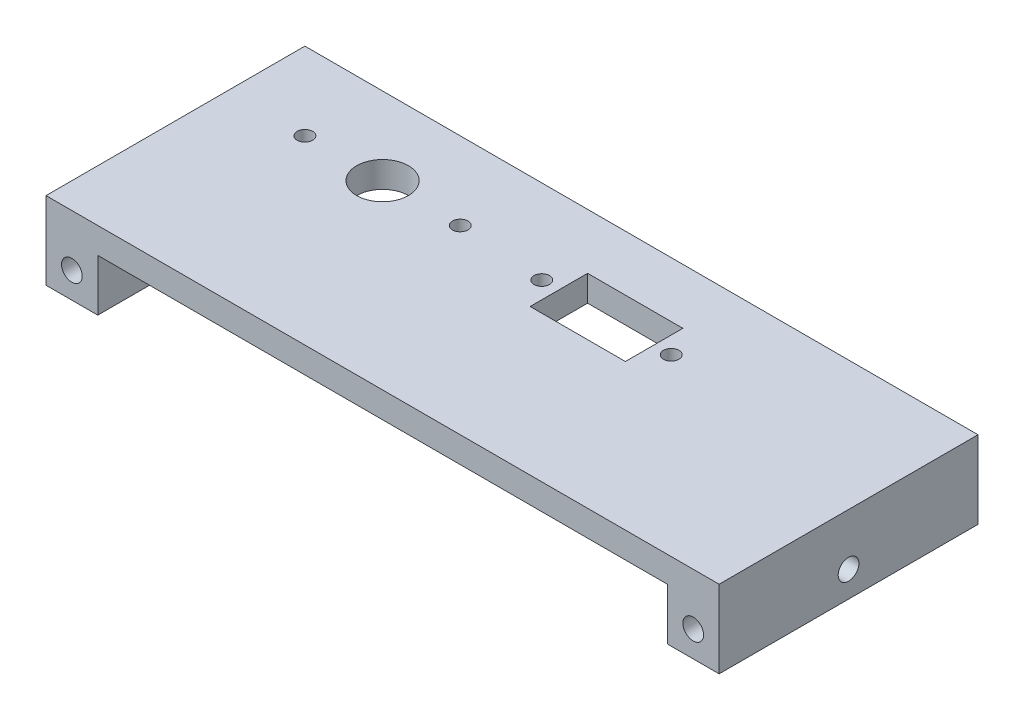
ISO-10303-21;
HEADER;
FILE_DESCRIPTION(('STEP AP214'),'2;1');
FILE_NAME('part.step','',(''),(''),'','','');
FILE_SCHEMA(('AUTOMOTIVE_DESIGN { 1 0 10303 214 1 1 1 1 }'));
ENDSEC;
DATA;
#1=APPLICATION_CONTEXT('core data for automotive mechanical design processes');
#2=APPLICATION_PROTOCOL_DEFINITION('international standard','automotive_design',2000,#1);
#3=PRODUCT_CONTEXT('',#1,'mechanical');
#4=PRODUCT('Part','Part','',(#3));
#5=PRODUCT_RELATED_PRODUCT_CATEGORY('part','',(#4));
#6=PRODUCT_DEFINITION_FORMATION('','',#4);
#7=PRODUCT_DEFINITION_CONTEXT('part definition',#1,'design');
#8=PRODUCT_DEFINITION('design','',#6,#7);
#9=PRODUCT_DEFINITION_SHAPE('','',#8);
#10=(LENGTH_UNIT() NAMED_UNIT(*) SI_UNIT(.MILLI.,.METRE.));
#11=(NAMED_UNIT(*) PLANE_ANGLE_UNIT() SI_UNIT($,.RADIAN.));
#12=(NAMED_UNIT(*) SI_UNIT($,.STERADIAN.) SOLID_ANGLE_UNIT());
#13=UNCERTAINTY_MEASURE_WITH_UNIT(LENGTH_MEASURE(1.E-05),#10,'distance_accuracy_value','');
#14=(GEOMETRIC_REPRESENTATION_CONTEXT(3) GLOBAL_UNCERTAINTY_ASSIGNED_CONTEXT((#13)) GLOBAL_UNIT_ASSIGNED_CONTEXT((#10,
#11,#12)) REPRESENTATION_CONTEXT('',''));
#15=CARTESIAN_POINT('',(0.,0.,0.));
#16=DIRECTION('',(0.,0.,1.));
#17=DIRECTION('',(1.,0.,0.));
#18=AXIS2_PLACEMENT_3D('',#15,#16,#17);
#19=CARTESIAN_POINT('',(0.,0.,0.));
#20=DIRECTION('',(0.,1.,0.));
#21=DIRECTION('',(0.,0.,1.));
#22=AXIS2_PLACEMENT_3D('',#19,#20,#21);
#23=PLANE('',#22);
#24=DIRECTION('',(-1.,0.,0.));
#25=VECTOR('',#24,1.);
#26=CARTESIAN_POINT('',(-130.,0.,-50.));
#27=LINE('',#26,#25);
#28=CARTESIAN_POINT('',(-120.,0.,-50.));
#29=VERTEX_POINT('',#28);
#30=CARTESIAN_POINT('',(-130.,0.,-50.));
#31=VERTEX_POINT('',#30);
#32=EDGE_CURVE('E284',#29,#31,#27,.T.);
#33=ORIENTED_EDGE('',*,*,#32,.F.);
#34=DIRECTION('',(0.,0.,1.));
#35=VECTOR('',#34,1.);
#36=CARTESIAN_POINT('',(-120.,0.,0.));
#37=LINE('',#36,#35);
#38=CARTESIAN_POINT('',(-120.,0.,0.));
#39=VERTEX_POINT('',#38);
#40=EDGE_CURVE('E307',#29,#39,#37,.T.);
#41=ORIENTED_EDGE('',*,*,#40,.T.);
#42=DIRECTION('',(1.,0.,0.));
#43=VECTOR('',#42,1.);
#44=CARTESIAN_POINT('',(-130.,0.,0.));
#45=LINE('',#44,#43);
#46=CARTESIAN_POINT('',(-130.,0.,0.));
#47=VERTEX_POINT('',#46);
#48=EDGE_CURVE('E277',#47,#39,#45,.T.);
#49=ORIENTED_EDGE('',*,*,#48,.F.);
#50=DIRECTION('',(0.,0.,1.));
#51=VECTOR('',#50,1.);
#52=CARTESIAN_POINT('',(-130.,0.,-50.));
#53=LINE('',#52,#51);
#54=EDGE_CURVE('E257',#31,#47,#53,.T.);
#55=ORIENTED_EDGE('',*,*,#54,.F.);
#56=EDGE_LOOP('',(#33,#41,#49,#55));
#57=FACE_BOUND('',#56,.T.);
#58=ADVANCED_FACE('F38',(#57),#23,.F.);
#59=CARTESIAN_POINT('',(-130.,15.,-50.));
#60=DIRECTION('',(1.,0.,0.));
#61=DIRECTION('',(0.,0.,-1.));
#62=AXIS2_PLACEMENT_3D('',#59,#60,#61);
#63=PLANE('',#62);
#64=CARTESIAN_POINT('',(-130.,5.,-25.));
#65=DIRECTION('',(-1.,0.,0.));
#66=DIRECTION('',(0.,0.,1.));
#67=AXIS2_PLACEMENT_3D('',#64,#65,#66);
#68=CIRCLE('',#67,2.);
#69=CARTESIAN_POINT('',(-130.,5.,-23.));
#70=VERTEX_POINT('',#69);
#71=EDGE_CURVE('E184',#70,#70,#68,.T.);
#72=ORIENTED_EDGE('',*,*,#71,.F.);
#73=EDGE_LOOP('',(#72));
#74=FACE_BOUND('',#73,.T.);
#75=ORIENTED_EDGE('',*,*,#54,.T.);
#76=DIRECTION('',(0.,-1.,0.));
#77=VECTOR('',#76,1.);
#78=CARTESIAN_POINT('',(-130.,15.,0.));
#79=LINE('',#78,#77);
#80=CARTESIAN_POINT('',(-130.,15.,0.));
#81=VERTEX_POINT('',#80);
#82=EDGE_CURVE('E299',#81,#47,#79,.T.);
#83=ORIENTED_EDGE('',*,*,#82,.F.);
#84=DIRECTION('',(0.,0.,1.));
#85=VECTOR('',#84,1.);
#86=CARTESIAN_POINT('',(-130.,15.,-50.));
#87=LINE('',#86,#85);
#88=CARTESIAN_POINT('',(-130.,15.,-50.));
#89=VERTEX_POINT('',#88);
#90=EDGE_CURVE('E258',#89,#81,#87,.T.);
#91=ORIENTED_EDGE('',*,*,#90,.F.);
#92=DIRECTION('',(0.,-1.,0.));
#93=VECTOR('',#92,1.);
#94=CARTESIAN_POINT('',(-130.,15.,-50.));
#95=LINE('',#94,#93);
#96=EDGE_CURVE('E272',#89,#31,#95,.T.);
#97=ORIENTED_EDGE('',*,*,#96,.T.);
#98=EDGE_LOOP('',(#75,#83,#91,#97));
#99=FACE_BOUND('',#98,.T.);
#100=ADVANCED_FACE('F40',(#74,#99),#63,.F.);
#101=CARTESIAN_POINT('',(-130.,15.,0.));
#102=DIRECTION('',(0.,0.,-1.));
#103=DIRECTION('',(-1.,0.,0.));
#104=AXIS2_PLACEMENT_3D('',#101,#102,#103);
#105=PLANE('',#104);
#106=CARTESIAN_POINT('',(-125.,5.,0.));
#107=DIRECTION('',(0.,0.,1.));
#108=DIRECTION('',(1.,0.,0.));
#109=AXIS2_PLACEMENT_3D('',#106,#107,#108);
#110=CIRCLE('',#109,2.);
#111=CARTESIAN_POINT('',(-123.,5.,0.));
#112=VERTEX_POINT('',#111);
#113=EDGE_CURVE('E202',#112,#112,#110,.T.);
#114=ORIENTED_EDGE('',*,*,#113,.F.);
#115=EDGE_LOOP('',(#114));
#116=FACE_BOUND('',#115,.T.);
#117=CARTESIAN_POINT('',(-5.,5.,0.));
#118=DIRECTION('',(0.,0.,1.));
#119=DIRECTION('',(1.,0.,0.));
#120=AXIS2_PLACEMENT_3D('',#117,#118,#119);
#121=CIRCLE('',#120,2.);
#122=CARTESIAN_POINT('',(-3.,5.,0.));
#123=VERTEX_POINT('',#122);
#124=EDGE_CURVE('E193',#123,#123,#121,.T.);
#125=ORIENTED_EDGE('',*,*,#124,.F.);
#126=EDGE_LOOP('',(#125));
#127=FACE_BOUND('',#126,.T.);
#128=ORIENTED_EDGE('',*,*,#48,.T.);
#129=DIRECTION('',(0.,1.,0.));
#130=VECTOR('',#129,1.);
#131=CARTESIAN_POINT('',(-120.,15.,0.));
#132=LINE('',#131,#130);
#133=CARTESIAN_POINT('',(-120.,10.,0.));
#134=VERTEX_POINT('',#133);
#135=EDGE_CURVE('E249',#39,#134,#132,.T.);
#136=ORIENTED_EDGE('',*,*,#135,.T.);
#137=DIRECTION('',(1.,0.,0.));
#138=VECTOR('',#137,1.);
#139=CARTESIAN_POINT('',(-130.,10.,0.));
#140=LINE('',#139,#138);
#141=CARTESIAN_POINT('',(-10.,10.,0.));
#142=VERTEX_POINT('',#141);
#143=EDGE_CURVE('E253',#134,#142,#140,.T.);
#144=ORIENTED_EDGE('',*,*,#143,.T.);
#145=DIRECTION('',(0.,-1.,0.));
#146=VECTOR('',#145,1.);
#147=CARTESIAN_POINT('',(-9.99999999999999,15.,0.));
#148=LINE('',#147,#146);
#149=CARTESIAN_POINT('',(-10.,0.,0.));
#150=VERTEX_POINT('',#149);
#151=EDGE_CURVE('E243',#142,#150,#148,.T.);
#152=ORIENTED_EDGE('',*,*,#151,.T.);
#153=CARTESIAN_POINT('',(0.,0.,0.));
#154=VERTEX_POINT('',#153);
#155=EDGE_CURVE('E276',#150,#154,#45,.T.);
#156=ORIENTED_EDGE('',*,*,#155,.T.);
#157=DIRECTION('',(0.,-1.,0.));
#158=VECTOR('',#157,1.);
#159=CARTESIAN_POINT('',(0.,15.,0.));
#160=LINE('',#159,#158);
#161=CARTESIAN_POINT('',(0.,15.,0.));
#162=VERTEX_POINT('',#161);
#163=EDGE_CURVE('E295',#162,#154,#160,.T.);
#164=ORIENTED_EDGE('',*,*,#163,.F.);
#165=DIRECTION('',(1.,0.,0.));
#166=VECTOR('',#165,1.);
#167=CARTESIAN_POINT('',(-130.,15.,0.));
#168=LINE('',#167,#166);
#169=EDGE_CURVE('E262',#81,#162,#168,.T.);
#170=ORIENTED_EDGE('',*,*,#169,.F.);
#171=ORIENTED_EDGE('',*,*,#82,.T.);
#172=EDGE_LOOP('',(#128,#136,#144,#152,#156,#164,#170,#171));
#173=FACE_BOUND('',#172,.T.);
#174=ADVANCED_FACE('F374',(#116,#127,#173),#105,.F.);
#175=CARTESIAN_POINT('',(0.,15.,-50.));
#176=DIRECTION('',(-1.,0.,0.));
#177=DIRECTION('',(0.,0.,1.));
#178=AXIS2_PLACEMENT_3D('',#175,#176,#177);
#179=PLANE('',#178);
#180=CARTESIAN_POINT('',(0.,5.,-25.));
#181=DIRECTION('',(1.,0.,0.));
#182=DIRECTION('',(0.,0.,-1.));
#183=AXIS2_PLACEMENT_3D('',#180,#181,#182);
#184=CIRCLE('',#183,2.);
#185=CARTESIAN_POINT('',(0.,5.,-27.));
#186=VERTEX_POINT('',#185);
#187=EDGE_CURVE('E183',#186,#186,#184,.T.);
#188=ORIENTED_EDGE('',*,*,#187,.F.);
#189=EDGE_LOOP('',(#188));
#190=FACE_BOUND('',#189,.T.);
#191=DIRECTION('',(0.,0.,-1.));
#192=VECTOR('',#191,1.);
#193=CARTESIAN_POINT('',(0.,0.,-50.));
#194=LINE('',#193,#192);
#195=CARTESIAN_POINT('',(0.,0.,-50.));
#196=VERTEX_POINT('',#195);
#197=EDGE_CURVE('E281',#154,#196,#194,.T.);
#198=ORIENTED_EDGE('',*,*,#197,.T.);
#199=DIRECTION('',(0.,-1.,0.));
#200=VECTOR('',#199,1.);
#201=CARTESIAN_POINT('',(0.,15.,-50.));
#202=LINE('',#201,#200);
#203=CARTESIAN_POINT('',(0.,15.,-50.));
#204=VERTEX_POINT('',#203);
#205=EDGE_CURVE('E291',#204,#196,#202,.T.);
#206=ORIENTED_EDGE('',*,*,#205,.F.);
#207=DIRECTION('',(0.,0.,-1.));
#208=VECTOR('',#207,1.);
#209=CARTESIAN_POINT('',(0.,15.,-50.));
#210=LINE('',#209,#208);
#211=EDGE_CURVE('E266',#162,#204,#210,.T.);
#212=ORIENTED_EDGE('',*,*,#211,.F.);
#213=ORIENTED_EDGE('',*,*,#163,.T.);
#214=EDGE_LOOP('',(#198,#206,#212,#213));
#215=FACE_BOUND('',#214,.T.);
#216=ADVANCED_FACE('F364',(#190,#215),#179,.F.);
#217=CARTESIAN_POINT('',(-130.,15.,-50.));
#218=DIRECTION('',(0.,0.,1.));
#219=DIRECTION('',(1.,0.,0.));
#220=AXIS2_PLACEMENT_3D('',#217,#218,#219);
#221=PLANE('',#220);
#222=CARTESIAN_POINT('',(-125.,5.,-50.));
#223=DIRECTION('',(0.,0.,-1.));
#224=DIRECTION('',(-1.,0.,0.));
#225=AXIS2_PLACEMENT_3D('',#222,#223,#224);
#226=CIRCLE('',#225,2.);
#227=CARTESIAN_POINT('',(-127.,5.,-50.));
#228=VERTEX_POINT('',#227);
#229=EDGE_CURVE('E218',#228,#228,#226,.T.);
#230=ORIENTED_EDGE('',*,*,#229,.F.);
#231=EDGE_LOOP('',(#230));
#232=FACE_BOUND('',#231,.T.);
#233=CARTESIAN_POINT('',(-5.,5.,-50.));
#234=DIRECTION('',(0.,0.,-1.));
#235=DIRECTION('',(-1.,0.,0.));
#236=AXIS2_PLACEMENT_3D('',#233,#234,#235);
#237=CIRCLE('',#236,2.);
#238=CARTESIAN_POINT('',(-7.,5.,-50.));
#239=VERTEX_POINT('',#238);
#240=EDGE_CURVE('E201',#239,#239,#237,.T.);
#241=ORIENTED_EDGE('',*,*,#240,.F.);
#242=EDGE_LOOP('',(#241));
#243=FACE_BOUND('',#242,.T.);
#244=DIRECTION('',(1.,0.,0.));
#245=VECTOR('',#244,1.);
#246=CARTESIAN_POINT('',(-10.,10.,-50.));
#247=LINE('',#246,#245);
#248=CARTESIAN_POINT('',(-120.,10.,-50.));
#249=VERTEX_POINT('',#248);
#250=CARTESIAN_POINT('',(-10.,10.,-50.));
#251=VERTEX_POINT('',#250);
#252=EDGE_CURVE('E232',#249,#251,#247,.T.);
#253=ORIENTED_EDGE('',*,*,#252,.F.);
#254=DIRECTION('',(0.,1.,0.));
#255=VECTOR('',#254,1.);
#256=CARTESIAN_POINT('',(-120.,0.,-50.));
#257=LINE('',#256,#255);
#258=EDGE_CURVE('E217',#29,#249,#257,.T.);
#259=ORIENTED_EDGE('',*,*,#258,.F.);
#260=ORIENTED_EDGE('',*,*,#32,.T.);
#261=ORIENTED_EDGE('',*,*,#96,.F.);
#262=DIRECTION('',(-1.,0.,0.));
#263=VECTOR('',#262,1.);
#264=CARTESIAN_POINT('',(-130.,15.,-50.));
#265=LINE('',#264,#263);
#266=EDGE_CURVE('E269',#204,#89,#265,.T.);
#267=ORIENTED_EDGE('',*,*,#266,.F.);
#268=ORIENTED_EDGE('',*,*,#205,.T.);
#269=CARTESIAN_POINT('',(-9.99999999999999,0.,-50.));
#270=VERTEX_POINT('',#269);
#271=EDGE_CURVE('E263',#196,#270,#27,.T.);
#272=ORIENTED_EDGE('',*,*,#271,.T.);
#273=DIRECTION('',(0.,-1.,0.));
#274=VECTOR('',#273,1.);
#275=CARTESIAN_POINT('',(-10.,0.,-50.));
#276=LINE('',#275,#274);
#277=EDGE_CURVE('E236',#251,#270,#276,.T.);
#278=ORIENTED_EDGE('',*,*,#277,.F.);
#279=EDGE_LOOP('',(#253,#259,#260,#261,#267,#268,#272,#278));
#280=FACE_BOUND('',#279,.T.);
#281=ADVANCED_FACE('F352',(#232,#243,#280),#221,.F.);
#282=CARTESIAN_POINT('',(0.,15.,0.));
#283=DIRECTION('',(0.,1.,0.));
#284=DIRECTION('',(0.,0.,1.));
#285=AXIS2_PLACEMENT_3D('',#282,#283,#284);
#286=PLANE('',#285);
#287=CARTESIAN_POINT('',(-68.,15.,-33.75));
#288=DIRECTION('',(0.,1.,0.));
#289=DIRECTION('',(0.,0.,1.));
#290=AXIS2_PLACEMENT_3D('',#287,#288,#289);
#291=CIRCLE('',#290,1.5);
#292=CARTESIAN_POINT('',(-68.,15.,-32.25));
#293=VERTEX_POINT('',#292);
#294=EDGE_CURVE('E331',#293,#293,#291,.T.);
#295=ORIENTED_EDGE('',*,*,#294,.F.);
#296=EDGE_LOOP('',(#295));
#297=FACE_BOUND('',#296,.T.);
#298=CARTESIAN_POINT('',(-43.,15.,-33.75));
#299=DIRECTION('',(0.,1.,0.));
#300=DIRECTION('',(0.,0.,1.));
#301=AXIS2_PLACEMENT_3D('',#298,#299,#300);
#302=CIRCLE('',#301,1.5);
#303=CARTESIAN_POINT('',(-43.,15.,-32.25));
#304=VERTEX_POINT('',#303);
#305=EDGE_CURVE('E161',#304,#304,#302,.T.);
#306=ORIENTED_EDGE('',*,*,#305,.F.);
#307=EDGE_LOOP('',(#306));
#308=FACE_BOUND('',#307,.T.);
#309=DIRECTION('',(0.,0.,-1.));
#310=VECTOR('',#309,1.);
#311=CARTESIAN_POINT('',(-46.3,15.,-28.2));
#312=LINE('',#311,#310);
#313=CARTESIAN_POINT('',(-46.3,15.,-28.2));
#314=VERTEX_POINT('',#313);
#315=CARTESIAN_POINT('',(-46.3,15.,-39.3));
#316=VERTEX_POINT('',#315);
#317=EDGE_CURVE('E56',#314,#316,#312,.T.);
#318=ORIENTED_EDGE('',*,*,#317,.F.);
#319=DIRECTION('',(1.,0.,0.));
#320=VECTOR('',#319,1.);
#321=CARTESIAN_POINT('',(-46.3,15.,-28.2));
#322=LINE('',#321,#320);
#323=CARTESIAN_POINT('',(-64.7,15.,-28.2));
#324=VERTEX_POINT('',#323);
#325=EDGE_CURVE('E151',#324,#314,#322,.T.);
#326=ORIENTED_EDGE('',*,*,#325,.F.);
#327=DIRECTION('',(0.,0.,1.));
#328=VECTOR('',#327,1.);
#329=CARTESIAN_POINT('',(-64.7,15.,-28.2));
#330=LINE('',#329,#328);
#331=CARTESIAN_POINT('',(-64.7,15.,-39.3));
#332=VERTEX_POINT('',#331);
#333=EDGE_CURVE('E133',#332,#324,#330,.T.);
#334=ORIENTED_EDGE('',*,*,#333,.F.);
#335=DIRECTION('',(-1.,0.,0.));
#336=VECTOR('',#335,1.);
#337=CARTESIAN_POINT('',(-46.3,15.,-39.3));
#338=LINE('',#337,#336);
#339=EDGE_CURVE('E143',#316,#332,#338,.T.);
#340=ORIENTED_EDGE('',*,*,#339,.F.);
#341=EDGE_LOOP('',(#318,#326,#334,#340));
#342=FACE_BOUND('',#341,.T.);
#343=CARTESIAN_POINT('',(-115.,15.,-35.));
#344=DIRECTION('',(0.,1.,0.));
#345=DIRECTION('',(0.,0.,1.));
#346=AXIS2_PLACEMENT_3D('',#343,#344,#345);
#347=CIRCLE('',#346,1.5);
#348=CARTESIAN_POINT('',(-115.,15.,-33.5));
#349=VERTEX_POINT('',#348);
#350=EDGE_CURVE('E166',#349,#349,#347,.T.);
#351=ORIENTED_EDGE('',*,*,#350,.F.);
#352=EDGE_LOOP('',(#351));
#353=FACE_BOUND('',#352,.T.);
#354=CARTESIAN_POINT('',(-99.9999999999999,15.,-35.));
#355=DIRECTION('',(0.,1.,0.));
#356=DIRECTION('',(0.,0.,1.));
#357=AXIS2_PLACEMENT_3D('',#354,#355,#356);
#358=CIRCLE('',#357,5.00000000000001);
#359=CARTESIAN_POINT('',(-99.9999999999999,15.,-30.));
#360=VERTEX_POINT('',#359);
#361=EDGE_CURVE('E171',#360,#360,#358,.T.);
#362=ORIENTED_EDGE('',*,*,#361,.F.);
#363=EDGE_LOOP('',(#362));
#364=FACE_BOUND('',#363,.T.);
#365=CARTESIAN_POINT('',(-84.9999999999999,15.,-35.));
#366=DIRECTION('',(0.,1.,0.));
#367=DIRECTION('',(0.,0.,1.));
#368=AXIS2_PLACEMENT_3D('',#365,#366,#367);
#369=CIRCLE('',#368,1.5);
#370=CARTESIAN_POINT('',(-84.9999999999999,15.,-33.5));
#371=VERTEX_POINT('',#370);
#372=EDGE_CURVE('E175',#371,#371,#369,.T.);
#373=ORIENTED_EDGE('',*,*,#372,.F.);
#374=EDGE_LOOP('',(#373));
#375=FACE_BOUND('',#374,.T.);
#376=ORIENTED_EDGE('',*,*,#90,.T.);
#377=ORIENTED_EDGE('',*,*,#169,.T.);
#378=ORIENTED_EDGE('',*,*,#211,.T.);
#379=ORIENTED_EDGE('',*,*,#266,.T.);
#380=EDGE_LOOP('',(#376,#377,#378,#379));
#381=FACE_BOUND('',#380,.T.);
#382=ADVANCED_FACE('F148',(#297,#308,#342,#353,#364,#375,#381),#286,.T.);
#383=ORIENTED_EDGE('',*,*,#155,.F.);
#384=DIRECTION('',(0.,0.,-1.));
#385=VECTOR('',#384,1.);
#386=CARTESIAN_POINT('',(-10.,0.,0.));
#387=LINE('',#386,#385);
#388=EDGE_CURVE('E303',#150,#270,#387,.T.);
#389=ORIENTED_EDGE('',*,*,#388,.T.);
#390=ORIENTED_EDGE('',*,*,#271,.F.);
#391=ORIENTED_EDGE('',*,*,#197,.F.);
#392=EDGE_LOOP('',(#383,#389,#390,#391));
#393=FACE_BOUND('',#392,.T.);
#394=ADVANCED_FACE('F351',(#393),#23,.F.);
#395=CARTESIAN_POINT('',(-10.,10.,1.));
#396=DIRECTION('',(0.,1.,0.));
#397=DIRECTION('',(0.,0.,1.));
#398=AXIS2_PLACEMENT_3D('',#395,#396,#397);
#399=PLANE('',#398);
#400=CARTESIAN_POINT('',(-68.,10.,-33.75));
#401=DIRECTION('',(0.,1.,0.));
#402=DIRECTION('',(0.,0.,1.));
#403=AXIS2_PLACEMENT_3D('',#400,#401,#402);
#404=CIRCLE('',#403,1.5);
#405=CARTESIAN_POINT('',(-68.,10.,-32.25));
#406=VERTEX_POINT('',#405);
#407=EDGE_CURVE('E42',#406,#406,#404,.T.);
#408=ORIENTED_EDGE('',*,*,#407,.T.);
#409=EDGE_LOOP('',(#408));
#410=FACE_BOUND('',#409,.T.);
#411=CARTESIAN_POINT('',(-43.,10.,-33.75));
#412=DIRECTION('',(0.,1.,0.));
#413=DIRECTION('',(0.,0.,1.));
#414=AXIS2_PLACEMENT_3D('',#411,#412,#413);
#415=CIRCLE('',#414,1.5);
#416=CARTESIAN_POINT('',(-43.,10.,-32.25));
#417=VERTEX_POINT('',#416);
#418=EDGE_CURVE('E328',#417,#417,#415,.T.);
#419=ORIENTED_EDGE('',*,*,#418,.T.);
#420=EDGE_LOOP('',(#419));
#421=FACE_BOUND('',#420,.T.);
#422=DIRECTION('',(1.,0.,0.));
#423=VECTOR('',#422,1.);
#424=CARTESIAN_POINT('',(-10.,10.,-28.2));
#425=LINE('',#424,#423);
#426=CARTESIAN_POINT('',(-64.7,10.,-28.2));
#427=VERTEX_POINT('',#426);
#428=CARTESIAN_POINT('',(-46.3,10.,-28.2));
#429=VERTEX_POINT('',#428);
#430=EDGE_CURVE('E48',#427,#429,#425,.T.);
#431=ORIENTED_EDGE('',*,*,#430,.T.);
#432=DIRECTION('',(0.,0.,-1.));
#433=VECTOR('',#432,1.);
#434=CARTESIAN_POINT('',(-46.3,10.,1.));
#435=LINE('',#434,#433);
#436=CARTESIAN_POINT('',(-46.3,10.,-39.3));
#437=VERTEX_POINT('',#436);
#438=EDGE_CURVE('E11',#429,#437,#435,.T.);
#439=ORIENTED_EDGE('',*,*,#438,.T.);
#440=DIRECTION('',(-1.,0.,0.));
#441=VECTOR('',#440,1.);
#442=CARTESIAN_POINT('',(-10.,10.,-39.3));
#443=LINE('',#442,#441);
#444=CARTESIAN_POINT('',(-64.7,10.,-39.3));
#445=VERTEX_POINT('',#444);
#446=EDGE_CURVE('E311',#437,#445,#443,.T.);
#447=ORIENTED_EDGE('',*,*,#446,.T.);
#448=DIRECTION('',(0.,0.,1.));
#449=VECTOR('',#448,1.);
#450=CARTESIAN_POINT('',(-64.7,10.,1.));
#451=LINE('',#450,#449);
#452=EDGE_CURVE('E136',#445,#427,#451,.T.);
#453=ORIENTED_EDGE('',*,*,#452,.T.);
#454=EDGE_LOOP('',(#431,#439,#447,#453));
#455=FACE_BOUND('',#454,.T.);
#456=CARTESIAN_POINT('',(-115.,10.,-35.));
#457=DIRECTION('',(0.,1.,0.));
#458=DIRECTION('',(0.,0.,1.));
#459=AXIS2_PLACEMENT_3D('',#456,#457,#458);
#460=CIRCLE('',#459,1.5);
#461=CARTESIAN_POINT('',(-115.,10.,-33.5));
#462=VERTEX_POINT('',#461);
#463=EDGE_CURVE('E188',#462,#462,#460,.T.);
#464=ORIENTED_EDGE('',*,*,#463,.T.);
#465=EDGE_LOOP('',(#464));
#466=FACE_BOUND('',#465,.T.);
#467=CARTESIAN_POINT('',(-99.9999999999999,10.,-35.));
#468=DIRECTION('',(0.,1.,0.));
#469=DIRECTION('',(0.,0.,1.));
#470=AXIS2_PLACEMENT_3D('',#467,#468,#469);
#471=CIRCLE('',#470,5.00000000000001);
#472=CARTESIAN_POINT('',(-99.9999999999999,10.,-30.));
#473=VERTEX_POINT('',#472);
#474=EDGE_CURVE('E315',#473,#473,#471,.T.);
#475=ORIENTED_EDGE('',*,*,#474,.T.);
#476=EDGE_LOOP('',(#475));
#477=FACE_BOUND('',#476,.T.);
#478=CARTESIAN_POINT('',(-84.9999999999999,10.,-35.));
#479=DIRECTION('',(0.,1.,0.));
#480=DIRECTION('',(0.,0.,1.));
#481=AXIS2_PLACEMENT_3D('',#478,#479,#480);
#482=CIRCLE('',#481,1.5);
#483=CARTESIAN_POINT('',(-84.9999999999999,10.,-33.5));
#484=VERTEX_POINT('',#483);
#485=EDGE_CURVE('E170',#484,#484,#482,.T.);
#486=ORIENTED_EDGE('',*,*,#485,.T.);
#487=EDGE_LOOP('',(#486));
#488=FACE_BOUND('',#487,.T.);
#489=DIRECTION('',(0.,0.,-1.));
#490=VECTOR('',#489,1.);
#491=CARTESIAN_POINT('',(-120.,10.,1.));
#492=LINE('',#491,#490);
#493=EDGE_CURVE('E239',#134,#249,#492,.T.);
#494=ORIENTED_EDGE('',*,*,#493,.T.);
#495=ORIENTED_EDGE('',*,*,#252,.T.);
#496=DIRECTION('',(0.,0.,-1.));
#497=VECTOR('',#496,1.);
#498=CARTESIAN_POINT('',(-10.,10.,1.));
#499=LINE('',#498,#497);
#500=EDGE_CURVE('E240',#142,#251,#499,.T.);
#501=ORIENTED_EDGE('',*,*,#500,.F.);
#502=ORIENTED_EDGE('',*,*,#143,.F.);
#503=EDGE_LOOP('',(#494,#495,#501,#502));
#504=FACE_BOUND('',#503,.T.);
#505=ADVANCED_FACE('F360',(#410,#421,#455,#466,#477,#488,#504),#399,.F.);
#506=CARTESIAN_POINT('',(-120.,0.,1.));
#507=DIRECTION('',(-1.,0.,0.));
#508=DIRECTION('',(0.,0.,1.));
#509=AXIS2_PLACEMENT_3D('',#506,#507,#508);
#510=PLANE('',#509);
#511=CARTESIAN_POINT('',(-120.,5.,-25.));
#512=DIRECTION('',(-1.,0.,0.));
#513=DIRECTION('',(0.,0.,1.));
#514=AXIS2_PLACEMENT_3D('',#511,#512,#513);
#515=CIRCLE('',#514,2.);
#516=CARTESIAN_POINT('',(-120.,5.,-23.));
#517=VERTEX_POINT('',#516);
#518=EDGE_CURVE('E179',#517,#517,#515,.T.);
#519=ORIENTED_EDGE('',*,*,#518,.T.);
#520=EDGE_LOOP('',(#519));
#521=FACE_BOUND('',#520,.T.);
#522=ORIENTED_EDGE('',*,*,#40,.F.);
#523=ORIENTED_EDGE('',*,*,#258,.T.);
#524=ORIENTED_EDGE('',*,*,#493,.F.);
#525=ORIENTED_EDGE('',*,*,#135,.F.);
#526=EDGE_LOOP('',(#522,#523,#524,#525));
#527=FACE_BOUND('',#526,.T.);
#528=ADVANCED_FACE('F394',(#521,#527),#510,.F.);
#529=CARTESIAN_POINT('',(-10.,0.,1.));
#530=DIRECTION('',(1.,0.,0.));
#531=DIRECTION('',(0.,0.,-1.));
#532=AXIS2_PLACEMENT_3D('',#529,#530,#531);
#533=PLANE('',#532);
#534=CARTESIAN_POINT('',(-10.,5.,-25.));
#535=DIRECTION('',(1.,0.,0.));
#536=DIRECTION('',(0.,0.,-1.));
#537=AXIS2_PLACEMENT_3D('',#534,#535,#536);
#538=CIRCLE('',#537,2.);
#539=CARTESIAN_POINT('',(-10.,5.,-27.));
#540=VERTEX_POINT('',#539);
#541=EDGE_CURVE('E189',#540,#540,#538,.T.);
#542=ORIENTED_EDGE('',*,*,#541,.T.);
#543=EDGE_LOOP('',(#542));
#544=FACE_BOUND('',#543,.T.);
#545=ORIENTED_EDGE('',*,*,#500,.T.);
#546=ORIENTED_EDGE('',*,*,#277,.T.);
#547=ORIENTED_EDGE('',*,*,#388,.F.);
#548=ORIENTED_EDGE('',*,*,#151,.F.);
#549=EDGE_LOOP('',(#545,#546,#547,#548));
#550=FACE_BOUND('',#549,.T.);
#551=ADVANCED_FACE('F416',(#544,#550),#533,.F.);
#552=CARTESIAN_POINT('',(-5.,5.,-40.));
#553=DIRECTION('',(0.,0.,-1.));
#554=DIRECTION('',(-1.,0.,0.));
#555=AXIS2_PLACEMENT_3D('',#552,#553,#554);
#556=CYLINDRICAL_SURFACE('',#555,2.);
#557=CARTESIAN_POINT('',(-5.,5.,-40.));
#558=DIRECTION('',(0.,0.,-1.));
#559=DIRECTION('',(-1.,0.,0.));
#560=AXIS2_PLACEMENT_3D('',#557,#558,#559);
#561=CIRCLE('',#560,2.);
#562=CARTESIAN_POINT('',(-7.,5.,-40.));
#563=VERTEX_POINT('',#562);
#564=EDGE_CURVE('E222',#563,#563,#561,.T.);
#565=ORIENTED_EDGE('',*,*,#564,.F.);
#566=EDGE_LOOP('',(#565));
#567=FACE_BOUND('',#566,.T.);
#568=ORIENTED_EDGE('',*,*,#240,.T.);
#569=EDGE_LOOP('',(#568));
#570=FACE_BOUND('',#569,.T.);
#571=ADVANCED_FACE('F418',(#567,#570),#556,.F.);
#572=CARTESIAN_POINT('',(-5.,5.,-40.));
#573=DIRECTION('',(0.,0.,-1.));
#574=DIRECTION('',(-1.,0.,0.));
#575=AXIS2_PLACEMENT_3D('',#572,#573,#574);
#576=PLANE('',#575);
#577=ORIENTED_EDGE('',*,*,#564,.T.);
#578=EDGE_LOOP('',(#577));
#579=FACE_BOUND('',#578,.T.);
#580=ADVANCED_FACE('F425',(#579),#576,.T.);
#581=CARTESIAN_POINT('',(-125.,5.,-40.));
#582=DIRECTION('',(0.,0.,-1.));
#583=DIRECTION('',(-1.,0.,0.));
#584=AXIS2_PLACEMENT_3D('',#581,#582,#583);
#585=CYLINDRICAL_SURFACE('',#584,2.);
#586=CARTESIAN_POINT('',(-125.,5.,-40.));
#587=DIRECTION('',(0.,0.,-1.));
#588=DIRECTION('',(-1.,0.,0.));
#589=AXIS2_PLACEMENT_3D('',#586,#587,#588);
#590=CIRCLE('',#589,2.);
#591=CARTESIAN_POINT('',(-127.,5.,-40.));
#592=VERTEX_POINT('',#591);
#593=EDGE_CURVE('E213',#592,#592,#590,.T.);
#594=ORIENTED_EDGE('',*,*,#593,.F.);
#595=EDGE_LOOP('',(#594));
#596=FACE_BOUND('',#595,.T.);
#597=ORIENTED_EDGE('',*,*,#229,.T.);
#598=EDGE_LOOP('',(#597));
#599=FACE_BOUND('',#598,.T.);
#600=ADVANCED_FACE('F485',(#596,#599),#585,.F.);
#601=CARTESIAN_POINT('',(-125.,5.,-40.));
#602=DIRECTION('',(0.,0.,-1.));
#603=DIRECTION('',(-1.,0.,0.));
#604=AXIS2_PLACEMENT_3D('',#601,#602,#603);
#605=PLANE('',#604);
#606=ORIENTED_EDGE('',*,*,#593,.T.);
#607=EDGE_LOOP('',(#606));
#608=FACE_BOUND('',#607,.T.);
#609=ADVANCED_FACE('F481',(#608),#605,.T.);
#610=CARTESIAN_POINT('',(-5.,5.,-10.));
#611=DIRECTION('',(0.,0.,1.));
#612=DIRECTION('',(1.,0.,0.));
#613=AXIS2_PLACEMENT_3D('',#610,#611,#612);
#614=CYLINDRICAL_SURFACE('',#613,2.);
#615=CARTESIAN_POINT('',(-5.,5.,-10.));
#616=DIRECTION('',(0.,0.,1.));
#617=DIRECTION('',(1.,0.,0.));
#618=AXIS2_PLACEMENT_3D('',#615,#616,#617);
#619=CIRCLE('',#618,2.);
#620=CARTESIAN_POINT('',(-3.,5.,-10.));
#621=VERTEX_POINT('',#620);
#622=EDGE_CURVE('E206',#621,#621,#619,.T.);
#623=ORIENTED_EDGE('',*,*,#622,.F.);
#624=EDGE_LOOP('',(#623));
#625=FACE_BOUND('',#624,.T.);
#626=ORIENTED_EDGE('',*,*,#124,.T.);
#627=EDGE_LOOP('',(#626));
#628=FACE_BOUND('',#627,.T.);
#629=ADVANCED_FACE('F477',(#625,#628),#614,.F.);
#630=CARTESIAN_POINT('',(-5.,5.,-10.));
#631=DIRECTION('',(0.,0.,1.));
#632=DIRECTION('',(1.,0.,0.));
#633=AXIS2_PLACEMENT_3D('',#630,#631,#632);
#634=PLANE('',#633);
#635=ORIENTED_EDGE('',*,*,#622,.T.);
#636=EDGE_LOOP('',(#635));
#637=FACE_BOUND('',#636,.T.);
#638=ADVANCED_FACE('F473',(#637),#634,.T.);
#639=CARTESIAN_POINT('',(-125.,5.,-10.));
#640=DIRECTION('',(0.,0.,1.));
#641=DIRECTION('',(1.,0.,0.));
#642=AXIS2_PLACEMENT_3D('',#639,#640,#641);
#643=CYLINDRICAL_SURFACE('',#642,2.);
#644=CARTESIAN_POINT('',(-125.,5.,-10.));
#645=DIRECTION('',(0.,0.,1.));
#646=DIRECTION('',(1.,0.,0.));
#647=AXIS2_PLACEMENT_3D('',#644,#645,#646);
#648=CIRCLE('',#647,2.);
#649=CARTESIAN_POINT('',(-123.,5.,-10.));
#650=VERTEX_POINT('',#649);
#651=EDGE_CURVE('E197',#650,#650,#648,.T.);
#652=ORIENTED_EDGE('',*,*,#651,.F.);
#653=EDGE_LOOP('',(#652));
#654=FACE_BOUND('',#653,.T.);
#655=ORIENTED_EDGE('',*,*,#113,.T.);
#656=EDGE_LOOP('',(#655));
#657=FACE_BOUND('',#656,.T.);
#658=ADVANCED_FACE('F469',(#654,#657),#643,.F.);
#659=CARTESIAN_POINT('',(-125.,5.,-10.));
#660=DIRECTION('',(0.,0.,1.));
#661=DIRECTION('',(1.,0.,0.));
#662=AXIS2_PLACEMENT_3D('',#659,#660,#661);
#663=PLANE('',#662);
#664=ORIENTED_EDGE('',*,*,#651,.T.);
#665=EDGE_LOOP('',(#664));
#666=FACE_BOUND('',#665,.T.);
#667=ADVANCED_FACE('F465',(#666),#663,.T.);
#668=CARTESIAN_POINT('',(-10.,5.,-25.));
#669=DIRECTION('',(1.,0.,0.));
#670=DIRECTION('',(0.,0.,-1.));
#671=AXIS2_PLACEMENT_3D('',#668,#669,#670);
#672=CYLINDRICAL_SURFACE('',#671,2.);
#673=ORIENTED_EDGE('',*,*,#541,.F.);
#674=EDGE_LOOP('',(#673));
#675=FACE_BOUND('',#674,.T.);
#676=ORIENTED_EDGE('',*,*,#187,.T.);
#677=EDGE_LOOP('',(#676));
#678=FACE_BOUND('',#677,.T.);
#679=ADVANCED_FACE('F458',(#675,#678),#672,.F.);
#680=CARTESIAN_POINT('',(-120.,5.,-25.));
#681=DIRECTION('',(-1.,0.,0.));
#682=DIRECTION('',(0.,0.,1.));
#683=AXIS2_PLACEMENT_3D('',#680,#681,#682);
#684=CYLINDRICAL_SURFACE('',#683,2.);
#685=ORIENTED_EDGE('',*,*,#518,.F.);
#686=EDGE_LOOP('',(#685));
#687=FACE_BOUND('',#686,.T.);
#688=ORIENTED_EDGE('',*,*,#71,.T.);
#689=EDGE_LOOP('',(#688));
#690=FACE_BOUND('',#689,.T.);
#691=ADVANCED_FACE('F448',(#687,#690),#684,.F.);
#692=CARTESIAN_POINT('',(-84.9999999999999,5.,-35.));
#693=DIRECTION('',(0.,1.,0.));
#694=DIRECTION('',(0.,0.,1.));
#695=AXIS2_PLACEMENT_3D('',#692,#693,#694);
#696=CYLINDRICAL_SURFACE('',#695,1.5);
#697=ORIENTED_EDGE('',*,*,#372,.T.);
#698=EDGE_LOOP('',(#697));
#699=FACE_BOUND('',#698,.T.);
#700=ORIENTED_EDGE('',*,*,#485,.F.);
#701=EDGE_LOOP('',(#700));
#702=FACE_BOUND('',#701,.T.);
#703=ADVANCED_FACE('F445',(#699,#702),#696,.F.);
#704=CARTESIAN_POINT('',(-99.9999999999999,5.,-35.));
#705=DIRECTION('',(0.,1.,0.));
#706=DIRECTION('',(0.,0.,1.));
#707=AXIS2_PLACEMENT_3D('',#704,#705,#706);
#708=CYLINDRICAL_SURFACE('',#707,5.00000000000001);
#709=ORIENTED_EDGE('',*,*,#361,.T.);
#710=EDGE_LOOP('',(#709));
#711=FACE_BOUND('',#710,.T.);
#712=ORIENTED_EDGE('',*,*,#474,.F.);
#713=EDGE_LOOP('',(#712));
#714=FACE_BOUND('',#713,.T.);
#715=ADVANCED_FACE('F447',(#711,#714),#708,.F.);
#716=CARTESIAN_POINT('',(-115.,5.,-35.));
#717=DIRECTION('',(0.,1.,0.));
#718=DIRECTION('',(0.,0.,1.));
#719=AXIS2_PLACEMENT_3D('',#716,#717,#718);
#720=CYLINDRICAL_SURFACE('',#719,1.5);
#721=ORIENTED_EDGE('',*,*,#350,.T.);
#722=EDGE_LOOP('',(#721));
#723=FACE_BOUND('',#722,.T.);
#724=ORIENTED_EDGE('',*,*,#463,.F.);
#725=EDGE_LOOP('',(#724));
#726=FACE_BOUND('',#725,.T.);
#727=ADVANCED_FACE('F455',(#723,#726),#720,.F.);
#728=CARTESIAN_POINT('',(-46.3,5.,-28.2));
#729=DIRECTION('',(1.,0.,0.));
#730=DIRECTION('',(0.,0.,-1.));
#731=AXIS2_PLACEMENT_3D('',#728,#729,#730);
#732=PLANE('',#731);
#733=DIRECTION('',(0.,1.,0.));
#734=VECTOR('',#733,1.);
#735=CARTESIAN_POINT('',(-46.3,5.,-28.2));
#736=LINE('',#735,#734);
#737=EDGE_CURVE('E158',#429,#314,#736,.T.);
#738=ORIENTED_EDGE('',*,*,#737,.T.);
#739=ORIENTED_EDGE('',*,*,#317,.T.);
#740=DIRECTION('',(0.,1.,0.));
#741=VECTOR('',#740,1.);
#742=CARTESIAN_POINT('',(-46.3,5.,-39.3));
#743=LINE('',#742,#741);
#744=EDGE_CURVE('E140',#437,#316,#743,.T.);
#745=ORIENTED_EDGE('',*,*,#744,.F.);
#746=ORIENTED_EDGE('',*,*,#438,.F.);
#747=EDGE_LOOP('',(#738,#739,#745,#746));
#748=FACE_BOUND('',#747,.T.);
#749=ADVANCED_FACE('F547',(#748),#732,.F.);
#750=CARTESIAN_POINT('',(-46.3,5.,-28.2));
#751=DIRECTION('',(0.,0.,1.));
#752=DIRECTION('',(1.,0.,0.));
#753=AXIS2_PLACEMENT_3D('',#750,#751,#752);
#754=PLANE('',#753);
#755=DIRECTION('',(0.,1.,0.));
#756=VECTOR('',#755,1.);
#757=CARTESIAN_POINT('',(-64.7,5.,-28.2));
#758=LINE('',#757,#756);
#759=EDGE_CURVE('E139',#427,#324,#758,.T.);
#760=ORIENTED_EDGE('',*,*,#759,.T.);
#761=ORIENTED_EDGE('',*,*,#325,.T.);
#762=ORIENTED_EDGE('',*,*,#737,.F.);
#763=ORIENTED_EDGE('',*,*,#430,.F.);
#764=EDGE_LOOP('',(#760,#761,#762,#763));
#765=FACE_BOUND('',#764,.T.);
#766=ADVANCED_FACE('F556',(#765),#754,.F.);
#767=CARTESIAN_POINT('',(-64.7,5.,-28.2));
#768=DIRECTION('',(-1.,0.,0.));
#769=DIRECTION('',(0.,0.,1.));
#770=AXIS2_PLACEMENT_3D('',#767,#768,#769);
#771=PLANE('',#770);
#772=DIRECTION('',(0.,1.,0.));
#773=VECTOR('',#772,1.);
#774=CARTESIAN_POINT('',(-64.7,5.,-39.3));
#775=LINE('',#774,#773);
#776=EDGE_CURVE('E64',#445,#332,#775,.T.);
#777=ORIENTED_EDGE('',*,*,#776,.T.);
#778=ORIENTED_EDGE('',*,*,#333,.T.);
#779=ORIENTED_EDGE('',*,*,#759,.F.);
#780=ORIENTED_EDGE('',*,*,#452,.F.);
#781=EDGE_LOOP('',(#777,#778,#779,#780));
#782=FACE_BOUND('',#781,.T.);
#783=ADVANCED_FACE('F130',(#782),#771,.F.);
#784=CARTESIAN_POINT('',(-46.3,5.,-39.3));
#785=DIRECTION('',(0.,0.,-1.));
#786=DIRECTION('',(-1.,0.,0.));
#787=AXIS2_PLACEMENT_3D('',#784,#785,#786);
#788=PLANE('',#787);
#789=ORIENTED_EDGE('',*,*,#744,.T.);
#790=ORIENTED_EDGE('',*,*,#339,.T.);
#791=ORIENTED_EDGE('',*,*,#776,.F.);
#792=ORIENTED_EDGE('',*,*,#446,.F.);
#793=EDGE_LOOP('',(#789,#790,#791,#792));
#794=FACE_BOUND('',#793,.T.);
#795=ADVANCED_FACE('F144',(#794),#788,.F.);
#796=CARTESIAN_POINT('',(-43.,5.,-33.75));
#797=DIRECTION('',(0.,1.,0.));
#798=DIRECTION('',(0.,0.,1.));
#799=AXIS2_PLACEMENT_3D('',#796,#797,#798);
#800=CYLINDRICAL_SURFACE('',#799,1.5);
#801=ORIENTED_EDGE('',*,*,#305,.T.);
#802=EDGE_LOOP('',(#801));
#803=FACE_BOUND('',#802,.T.);
#804=ORIENTED_EDGE('',*,*,#418,.F.);
#805=EDGE_LOOP('',(#804));
#806=FACE_BOUND('',#805,.T.);
#807=ADVANCED_FACE('F347',(#803,#806),#800,.F.);
#808=CARTESIAN_POINT('',(-68.,5.,-33.75));
#809=DIRECTION('',(0.,1.,0.));
#810=DIRECTION('',(0.,0.,1.));
#811=AXIS2_PLACEMENT_3D('',#808,#809,#810);
#812=CYLINDRICAL_SURFACE('',#811,1.5);
#813=ORIENTED_EDGE('',*,*,#294,.T.);
#814=EDGE_LOOP('',(#813));
#815=FACE_BOUND('',#814,.T.);
#816=ORIENTED_EDGE('',*,*,#407,.F.);
#817=EDGE_LOOP('',(#816));
#818=FACE_BOUND('',#817,.T.);
#819=ADVANCED_FACE('F581',(#815,#818),#812,.F.);
#820=CLOSED_SHELL('',(#58,#100,#174,#216,#281,#382,#394,#505,#528,#551,#571,#580,#600,#609,#629,
#638,#658,#667,#679,#691,#703,#715,#727,#749,#766,#783,#795,#807,#819));
#821=MANIFOLD_SOLID_BREP('B2',#820);
#822=ADVANCED_BREP_SHAPE_REPRESENTATION('',(#18,#821),#14);
#823=SHAPE_DEFINITION_REPRESENTATION(#9,#822);
ENDSEC;
END-ISO-10303-21;
